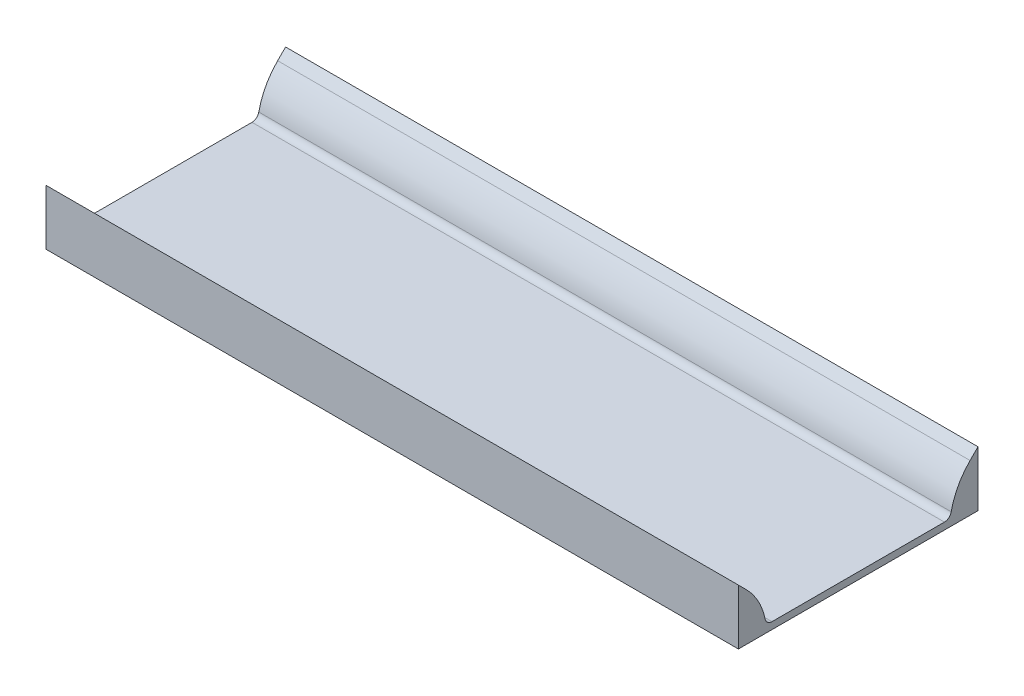
ISO-10303-21;
HEADER;
FILE_DESCRIPTION(('STEP AP214'),'2;1');
FILE_NAME('part.step','',(''),(''),'','','');
FILE_SCHEMA(('AUTOMOTIVE_DESIGN { 1 0 10303 214 1 1 1 1 }'));
ENDSEC;
DATA;
#1=APPLICATION_CONTEXT('core data for automotive mechanical design processes');
#2=APPLICATION_PROTOCOL_DEFINITION('international standard','automotive_design',2000,#1);
#3=PRODUCT_CONTEXT('',#1,'mechanical');
#4=PRODUCT('Part','Part','',(#3));
#5=PRODUCT_RELATED_PRODUCT_CATEGORY('part','',(#4));
#6=PRODUCT_DEFINITION_FORMATION('','',#4);
#7=PRODUCT_DEFINITION_CONTEXT('part definition',#1,'design');
#8=PRODUCT_DEFINITION('design','',#6,#7);
#9=PRODUCT_DEFINITION_SHAPE('','',#8);
#10=(LENGTH_UNIT() NAMED_UNIT(*) SI_UNIT(.MILLI.,.METRE.));
#11=(NAMED_UNIT(*) PLANE_ANGLE_UNIT() SI_UNIT($,.RADIAN.));
#12=(NAMED_UNIT(*) SI_UNIT($,.STERADIAN.) SOLID_ANGLE_UNIT());
#13=UNCERTAINTY_MEASURE_WITH_UNIT(LENGTH_MEASURE(1.E-05),#10,'distance_accuracy_value','');
#14=(GEOMETRIC_REPRESENTATION_CONTEXT(3) GLOBAL_UNCERTAINTY_ASSIGNED_CONTEXT((#13)) GLOBAL_UNIT_ASSIGNED_CONTEXT((#10,
#11,#12)) REPRESENTATION_CONTEXT('',''));
#15=CARTESIAN_POINT('',(0.,0.,0.));
#16=DIRECTION('',(0.,0.,1.));
#17=DIRECTION('',(1.,0.,0.));
#18=AXIS2_PLACEMENT_3D('',#15,#16,#17);
#19=CARTESIAN_POINT('',(63.5,10.16,-21.971));
#20=DIRECTION('',(-1.,0.,0.));
#21=DIRECTION('',(0.,0.,1.));
#22=AXIS2_PLACEMENT_3D('',#19,#20,#21);
#23=PLANE('',#22);
#24=DIRECTION('',(0.,0.,-1.));
#25=VECTOR('',#24,1.);
#26=CARTESIAN_POINT('',(63.5,1.27,0.));
#27=LINE('',#26,#25);
#28=CARTESIAN_POINT('',(63.5,1.27,15.8132118717615));
#29=VERTEX_POINT('',#28);
#30=CARTESIAN_POINT('',(63.5,1.27,-15.8132118717615));
#31=VERTEX_POINT('',#30);
#32=EDGE_CURVE('E179',#29,#31,#27,.T.);
#33=ORIENTED_EDGE('',*,*,#32,.F.);
#34=CARTESIAN_POINT('',(63.5,2.54,15.8132118717615));
#35=DIRECTION('',(-1.,0.,0.));
#36=DIRECTION('',(0.,0.,1.));
#37=AXIS2_PLACEMENT_3D('',#34,#35,#36);
#38=CIRCLE('',#37,1.27);
#39=CARTESIAN_POINT('',(63.5,2.28410749572498,17.0571648557025));
#40=VERTEX_POINT('',#39);
#41=EDGE_CURVE('E175',#29,#40,#38,.T.);
#42=ORIENTED_EDGE('',*,*,#41,.T.);
#43=CARTESIAN_POINT('',(63.5,-0.274817547025219,29.4966946951131));
#44=DIRECTION('',(-1.,0.,0.));
#45=DIRECTION('',(0.,0.,1.));
#46=AXIS2_PLACEMENT_3D('',#43,#44,#45);
#47=CIRCLE('',#46,12.7);
#48=CARTESIAN_POINT('',(63.5,8.70543857404397,20.516438574044));
#49=VERTEX_POINT('',#48);
#50=EDGE_CURVE('E156',#40,#49,#47,.F.);
#51=ORIENTED_EDGE('',*,*,#50,.T.);
#52=DIRECTION('',(0.,0.707106781186546,0.70710678118655));
#53=VECTOR('',#52,1.);
#54=CARTESIAN_POINT('',(63.5,5.08,16.891));
#55=LINE('',#54,#53);
#56=CARTESIAN_POINT('',(63.5,10.16,21.971));
#57=VERTEX_POINT('',#56);
#58=EDGE_CURVE('E126',#49,#57,#55,.T.);
#59=ORIENTED_EDGE('',*,*,#58,.T.);
#60=DIRECTION('',(0.,-1.,0.));
#61=VECTOR('',#60,1.);
#62=CARTESIAN_POINT('',(63.5,10.16,21.971));
#63=LINE('',#62,#61);
#64=CARTESIAN_POINT('',(63.5,0.,21.971));
#65=VERTEX_POINT('',#64);
#66=EDGE_CURVE('E201',#57,#65,#63,.T.);
#67=ORIENTED_EDGE('',*,*,#66,.T.);
#68=DIRECTION('',(0.,0.,-1.));
#69=VECTOR('',#68,1.);
#70=CARTESIAN_POINT('',(63.5,0.,-21.971));
#71=LINE('',#70,#69);
#72=CARTESIAN_POINT('',(63.5,0.,-21.971));
#73=VERTEX_POINT('',#72);
#74=EDGE_CURVE('E142',#65,#73,#71,.T.);
#75=ORIENTED_EDGE('',*,*,#74,.T.);
#76=DIRECTION('',(0.,-1.,0.));
#77=VECTOR('',#76,1.);
#78=CARTESIAN_POINT('',(63.5,10.16,-21.971));
#79=LINE('',#78,#77);
#80=CARTESIAN_POINT('',(63.5,10.16,-21.971));
#81=VERTEX_POINT('',#80);
#82=EDGE_CURVE('E127',#81,#73,#79,.T.);
#83=ORIENTED_EDGE('',*,*,#82,.F.);
#84=DIRECTION('',(0.,0.707106781186551,-0.707106781186544));
#85=VECTOR('',#84,1.);
#86=CARTESIAN_POINT('',(63.5,10.16,-21.971));
#87=LINE('',#86,#85);
#88=CARTESIAN_POINT('',(63.5,8.70543857404386,-20.5164385740439));
#89=VERTEX_POINT('',#88);
#90=EDGE_CURVE('E115',#81,#89,#87,.F.);
#91=ORIENTED_EDGE('',*,*,#90,.T.);
#92=CARTESIAN_POINT('',(63.5,-0.27481754702525,-29.4966946951131));
#93=DIRECTION('',(-1.,0.,0.));
#94=DIRECTION('',(0.,0.,1.));
#95=AXIS2_PLACEMENT_3D('',#92,#93,#94);
#96=CIRCLE('',#95,12.7);
#97=CARTESIAN_POINT('',(63.5,2.28410749572498,-17.0571648557025));
#98=VERTEX_POINT('',#97);
#99=EDGE_CURVE('E154',#89,#98,#96,.F.);
#100=ORIENTED_EDGE('',*,*,#99,.T.);
#101=CARTESIAN_POINT('',(63.5,2.54,-15.8132118717615));
#102=DIRECTION('',(-1.,0.,0.));
#103=DIRECTION('',(0.,0.,1.));
#104=AXIS2_PLACEMENT_3D('',#101,#102,#103);
#105=CIRCLE('',#104,1.27);
#106=EDGE_CURVE('E47',#98,#31,#105,.T.);
#107=ORIENTED_EDGE('',*,*,#106,.T.);
#108=EDGE_LOOP('',(#33,#42,#51,#59,#67,#75,#83,#91,#100,#107));
#109=FACE_BOUND('',#108,.T.);
#110=ADVANCED_FACE('F39',(#109),#23,.F.);
#111=CARTESIAN_POINT('',(-63.5,10.16,-21.971));
#112=DIRECTION('',(0.,0.,1.));
#113=DIRECTION('',(1.,0.,0.));
#114=AXIS2_PLACEMENT_3D('',#111,#112,#113);
#115=PLANE('',#114);
#116=DIRECTION('',(-1.,0.,0.));
#117=VECTOR('',#116,1.);
#118=CARTESIAN_POINT('',(-63.5,0.,-21.971));
#119=LINE('',#118,#117);
#120=CARTESIAN_POINT('',(-63.5,0.,-21.971));
#121=VERTEX_POINT('',#120);
#122=EDGE_CURVE('E195',#73,#121,#119,.T.);
#123=ORIENTED_EDGE('',*,*,#122,.T.);
#124=DIRECTION('',(0.,-1.,0.));
#125=VECTOR('',#124,1.);
#126=CARTESIAN_POINT('',(-63.5,10.16,-21.971));
#127=LINE('',#126,#125);
#128=CARTESIAN_POINT('',(-63.5,10.16,-21.971));
#129=VERTEX_POINT('',#128);
#130=EDGE_CURVE('E135',#129,#121,#127,.T.);
#131=ORIENTED_EDGE('',*,*,#130,.F.);
#132=DIRECTION('',(-1.,0.,0.));
#133=VECTOR('',#132,1.);
#134=CARTESIAN_POINT('',(-63.5,10.16,-21.971));
#135=LINE('',#134,#133);
#136=EDGE_CURVE('E119',#81,#129,#135,.T.);
#137=ORIENTED_EDGE('',*,*,#136,.F.);
#138=ORIENTED_EDGE('',*,*,#82,.T.);
#139=EDGE_LOOP('',(#123,#131,#137,#138));
#140=FACE_BOUND('',#139,.T.);
#141=ADVANCED_FACE('F132',(#140),#115,.F.);
#142=CARTESIAN_POINT('',(-63.5,10.16,-21.971));
#143=DIRECTION('',(1.,0.,0.));
#144=DIRECTION('',(0.,0.,-1.));
#145=AXIS2_PLACEMENT_3D('',#142,#143,#144);
#146=PLANE('',#145);
#147=DIRECTION('',(0.,-0.707106781186546,-0.70710678118655));
#148=VECTOR('',#147,1.);
#149=CARTESIAN_POINT('',(-63.5,5.08,16.891));
#150=LINE('',#149,#148);
#151=CARTESIAN_POINT('',(-63.5,10.16,21.971));
#152=VERTEX_POINT('',#151);
#153=CARTESIAN_POINT('',(-63.5,8.70543857404397,20.516438574044));
#154=VERTEX_POINT('',#153);
#155=EDGE_CURVE('E151',#152,#154,#150,.T.);
#156=ORIENTED_EDGE('',*,*,#155,.T.);
#157=CARTESIAN_POINT('',(-63.5,-0.274817547025219,29.4966946951131));
#158=DIRECTION('',(1.,0.,0.));
#159=DIRECTION('',(0.,0.,-1.));
#160=AXIS2_PLACEMENT_3D('',#157,#158,#159);
#161=CIRCLE('',#160,12.7);
#162=CARTESIAN_POINT('',(-63.5,2.28410749572498,17.0571648557025));
#163=VERTEX_POINT('',#162);
#164=EDGE_CURVE('E162',#154,#163,#161,.F.);
#165=ORIENTED_EDGE('',*,*,#164,.T.);
#166=CARTESIAN_POINT('',(-63.5,2.54,15.8132118717615));
#167=DIRECTION('',(1.,0.,0.));
#168=DIRECTION('',(0.,0.,-1.));
#169=AXIS2_PLACEMENT_3D('',#166,#167,#168);
#170=CIRCLE('',#169,1.27);
#171=CARTESIAN_POINT('',(-63.5,1.27,15.8132118717615));
#172=VERTEX_POINT('',#171);
#173=EDGE_CURVE('E177',#163,#172,#170,.T.);
#174=ORIENTED_EDGE('',*,*,#173,.T.);
#175=DIRECTION('',(0.,0.,1.));
#176=VECTOR('',#175,1.);
#177=CARTESIAN_POINT('',(-63.5,1.27,0.));
#178=LINE('',#177,#176);
#179=CARTESIAN_POINT('',(-63.5,1.27,-15.8132118717615));
#180=VERTEX_POINT('',#179);
#181=EDGE_CURVE('E184',#180,#172,#178,.T.);
#182=ORIENTED_EDGE('',*,*,#181,.F.);
#183=CARTESIAN_POINT('',(-63.5,2.54,-15.8132118717615));
#184=DIRECTION('',(1.,0.,0.));
#185=DIRECTION('',(0.,0.,-1.));
#186=AXIS2_PLACEMENT_3D('',#183,#184,#185);
#187=CIRCLE('',#186,1.27);
#188=CARTESIAN_POINT('',(-63.5,2.28410749572498,-17.0571648557025));
#189=VERTEX_POINT('',#188);
#190=EDGE_CURVE('E11',#180,#189,#187,.T.);
#191=ORIENTED_EDGE('',*,*,#190,.T.);
#192=CARTESIAN_POINT('',(-63.5,-0.27481754702525,-29.4966946951131));
#193=DIRECTION('',(1.,0.,0.));
#194=DIRECTION('',(0.,0.,-1.));
#195=AXIS2_PLACEMENT_3D('',#192,#193,#194);
#196=CIRCLE('',#195,12.7);
#197=CARTESIAN_POINT('',(-63.5,8.70543857404386,-20.5164385740439));
#198=VERTEX_POINT('',#197);
#199=EDGE_CURVE('E160',#189,#198,#196,.F.);
#200=ORIENTED_EDGE('',*,*,#199,.T.);
#201=DIRECTION('',(0.,-0.707106781186551,0.707106781186544));
#202=VECTOR('',#201,1.);
#203=CARTESIAN_POINT('',(-63.5,10.16,-21.971));
#204=LINE('',#203,#202);
#205=EDGE_CURVE('E149',#198,#129,#204,.F.);
#206=ORIENTED_EDGE('',*,*,#205,.T.);
#207=ORIENTED_EDGE('',*,*,#130,.T.);
#208=DIRECTION('',(0.,0.,1.));
#209=VECTOR('',#208,1.);
#210=CARTESIAN_POINT('',(-63.5,0.,-21.971));
#211=LINE('',#210,#209);
#212=CARTESIAN_POINT('',(-63.5,0.,21.971));
#213=VERTEX_POINT('',#212);
#214=EDGE_CURVE('E190',#121,#213,#211,.T.);
#215=ORIENTED_EDGE('',*,*,#214,.T.);
#216=DIRECTION('',(0.,-1.,0.));
#217=VECTOR('',#216,1.);
#218=CARTESIAN_POINT('',(-63.5,10.16,21.971));
#219=LINE('',#218,#217);
#220=EDGE_CURVE('E144',#152,#213,#219,.T.);
#221=ORIENTED_EDGE('',*,*,#220,.F.);
#222=EDGE_LOOP('',(#156,#165,#174,#182,#191,#200,#206,#207,#215,#221));
#223=FACE_BOUND('',#222,.T.);
#224=ADVANCED_FACE('F188',(#223),#146,.F.);
#225=CARTESIAN_POINT('',(-63.5,10.16,21.971));
#226=DIRECTION('',(0.,0.,-1.));
#227=DIRECTION('',(-1.,0.,0.));
#228=AXIS2_PLACEMENT_3D('',#225,#226,#227);
#229=PLANE('',#228);
#230=DIRECTION('',(1.,0.,0.));
#231=VECTOR('',#230,1.);
#232=CARTESIAN_POINT('',(-63.5,0.,21.971));
#233=LINE('',#232,#231);
#234=EDGE_CURVE('E137',#213,#65,#233,.T.);
#235=ORIENTED_EDGE('',*,*,#234,.T.);
#236=ORIENTED_EDGE('',*,*,#66,.F.);
#237=DIRECTION('',(1.,0.,0.));
#238=VECTOR('',#237,1.);
#239=CARTESIAN_POINT('',(-63.5,10.16,21.971));
#240=LINE('',#239,#238);
#241=EDGE_CURVE('E136',#152,#57,#240,.T.);
#242=ORIENTED_EDGE('',*,*,#241,.F.);
#243=ORIENTED_EDGE('',*,*,#220,.T.);
#244=EDGE_LOOP('',(#235,#236,#242,#243));
#245=FACE_BOUND('',#244,.T.);
#246=ADVANCED_FACE('F204',(#245),#229,.F.);
#247=CARTESIAN_POINT('',(0.,0.,0.));
#248=DIRECTION('',(0.,1.,0.));
#249=DIRECTION('',(0.,0.,1.));
#250=AXIS2_PLACEMENT_3D('',#247,#248,#249);
#251=PLANE('',#250);
#252=ORIENTED_EDGE('',*,*,#74,.F.);
#253=ORIENTED_EDGE('',*,*,#234,.F.);
#254=ORIENTED_EDGE('',*,*,#214,.F.);
#255=ORIENTED_EDGE('',*,*,#122,.F.);
#256=EDGE_LOOP('',(#252,#253,#254,#255));
#257=FACE_BOUND('',#256,.T.);
#258=ADVANCED_FACE('F194',(#257),#251,.F.);
#259=CARTESIAN_POINT('',(0.,1.27,0.));
#260=DIRECTION('',(0.,1.,0.));
#261=DIRECTION('',(0.,0.,1.));
#262=AXIS2_PLACEMENT_3D('',#259,#260,#261);
#263=PLANE('',#262);
#264=ORIENTED_EDGE('',*,*,#181,.T.);
#265=DIRECTION('',(1.,0.,0.));
#266=VECTOR('',#265,1.);
#267=CARTESIAN_POINT('',(63.5,1.27,15.8132118717615));
#268=LINE('',#267,#266);
#269=EDGE_CURVE('E168',#172,#29,#268,.T.);
#270=ORIENTED_EDGE('',*,*,#269,.T.);
#271=ORIENTED_EDGE('',*,*,#32,.T.);
#272=DIRECTION('',(1.,0.,0.));
#273=VECTOR('',#272,1.);
#274=CARTESIAN_POINT('',(-63.5,1.27,-15.8132118717615));
#275=LINE('',#274,#273);
#276=EDGE_CURVE('E166',#31,#180,#275,.F.);
#277=ORIENTED_EDGE('',*,*,#276,.T.);
#278=EDGE_LOOP('',(#264,#270,#271,#277));
#279=FACE_BOUND('',#278,.T.);
#280=ADVANCED_FACE('F182',(#279),#263,.T.);
#281=CARTESIAN_POINT('',(0.,5.08,16.891));
#282=DIRECTION('',(0.,0.70710678118655,-0.707106781186546));
#283=DIRECTION('',(-1.,0.,0.));
#284=AXIS2_PLACEMENT_3D('',#281,#282,#283);
#285=PLANE('',#284);
#286=ORIENTED_EDGE('',*,*,#58,.F.);
#287=DIRECTION('',(1.,0.,0.));
#288=VECTOR('',#287,1.);
#289=CARTESIAN_POINT('',(-63.5,8.70543857404397,20.516438574044));
#290=LINE('',#289,#288);
#291=EDGE_CURVE('E158',#49,#154,#290,.F.);
#292=ORIENTED_EDGE('',*,*,#291,.T.);
#293=ORIENTED_EDGE('',*,*,#155,.F.);
#294=ORIENTED_EDGE('',*,*,#241,.T.);
#295=EDGE_LOOP('',(#286,#292,#293,#294));
#296=FACE_BOUND('',#295,.T.);
#297=ADVANCED_FACE('F221',(#296),#285,.T.);
#298=CARTESIAN_POINT('',(0.,10.16,-21.971));
#299=DIRECTION('',(0.,-0.707106781186544,-0.707106781186551));
#300=DIRECTION('',(1.,0.,0.));
#301=AXIS2_PLACEMENT_3D('',#298,#299,#300);
#302=PLANE('',#301);
#303=ORIENTED_EDGE('',*,*,#205,.F.);
#304=DIRECTION('',(-1.,0.,0.));
#305=VECTOR('',#304,1.);
#306=CARTESIAN_POINT('',(63.5,8.70543857404386,-20.5164385740439));
#307=LINE('',#306,#305);
#308=EDGE_CURVE('E121',#198,#89,#307,.F.);
#309=ORIENTED_EDGE('',*,*,#308,.T.);
#310=ORIENTED_EDGE('',*,*,#90,.F.);
#311=ORIENTED_EDGE('',*,*,#136,.T.);
#312=EDGE_LOOP('',(#303,#309,#310,#311));
#313=FACE_BOUND('',#312,.T.);
#314=ADVANCED_FACE('F118',(#313),#302,.F.);
#315=CARTESIAN_POINT('',(0.,-0.274817547025219,29.4966946951131));
#316=DIRECTION('',(-1.,0.,0.));
#317=DIRECTION('',(0.,0.,1.));
#318=AXIS2_PLACEMENT_3D('',#315,#316,#317);
#319=CYLINDRICAL_SURFACE('',#318,12.7);
#320=ORIENTED_EDGE('',*,*,#50,.F.);
#321=DIRECTION('',(-1.,0.,0.));
#322=VECTOR('',#321,1.);
#323=CARTESIAN_POINT('',(0.,2.28410749572498,17.0571648557025));
#324=LINE('',#323,#322);
#325=EDGE_CURVE('E171',#40,#163,#324,.T.);
#326=ORIENTED_EDGE('',*,*,#325,.T.);
#327=ORIENTED_EDGE('',*,*,#164,.F.);
#328=ORIENTED_EDGE('',*,*,#291,.F.);
#329=EDGE_LOOP('',(#320,#326,#327,#328));
#330=FACE_BOUND('',#329,.T.);
#331=ADVANCED_FACE('F214',(#330),#319,.T.);
#332=CARTESIAN_POINT('',(0.,-0.27481754702525,-29.4966946951131));
#333=DIRECTION('',(-1.,0.,0.));
#334=DIRECTION('',(0.,0.,1.));
#335=AXIS2_PLACEMENT_3D('',#332,#333,#334);
#336=CYLINDRICAL_SURFACE('',#335,12.7);
#337=ORIENTED_EDGE('',*,*,#199,.F.);
#338=DIRECTION('',(-1.,0.,0.));
#339=VECTOR('',#338,1.);
#340=CARTESIAN_POINT('',(0.,2.28410749572498,-17.0571648557025));
#341=LINE('',#340,#339);
#342=EDGE_CURVE('E173',#189,#98,#341,.F.);
#343=ORIENTED_EDGE('',*,*,#342,.T.);
#344=ORIENTED_EDGE('',*,*,#99,.F.);
#345=ORIENTED_EDGE('',*,*,#308,.F.);
#346=EDGE_LOOP('',(#337,#343,#344,#345));
#347=FACE_BOUND('',#346,.T.);
#348=ADVANCED_FACE('F187',(#347),#336,.T.);
#349=CARTESIAN_POINT('',(0.,2.54,15.8132118717615));
#350=DIRECTION('',(-1.,0.,0.));
#351=DIRECTION('',(0.,0.,1.));
#352=AXIS2_PLACEMENT_3D('',#349,#350,#351);
#353=CYLINDRICAL_SURFACE('',#352,1.27);
#354=ORIENTED_EDGE('',*,*,#173,.F.);
#355=ORIENTED_EDGE('',*,*,#325,.F.);
#356=ORIENTED_EDGE('',*,*,#41,.F.);
#357=ORIENTED_EDGE('',*,*,#269,.F.);
#358=EDGE_LOOP('',(#354,#355,#356,#357));
#359=FACE_BOUND('',#358,.T.);
#360=ADVANCED_FACE('F217',(#359),#353,.F.);
#361=CARTESIAN_POINT('',(0.,2.54,-15.8132118717615));
#362=DIRECTION('',(-1.,0.,0.));
#363=DIRECTION('',(0.,0.,1.));
#364=AXIS2_PLACEMENT_3D('',#361,#362,#363);
#365=CYLINDRICAL_SURFACE('',#364,1.27);
#366=ORIENTED_EDGE('',*,*,#190,.F.);
#367=ORIENTED_EDGE('',*,*,#276,.F.);
#368=ORIENTED_EDGE('',*,*,#106,.F.);
#369=ORIENTED_EDGE('',*,*,#342,.F.);
#370=EDGE_LOOP('',(#366,#367,#368,#369));
#371=FACE_BOUND('',#370,.T.);
#372=ADVANCED_FACE('F41',(#371),#365,.F.);
#373=CLOSED_SHELL('',(#110,#141,#224,#246,#258,#280,#297,#314,#331,#348,#360,#372));
#374=MANIFOLD_SOLID_BREP('B2',#373);
#375=ADVANCED_BREP_SHAPE_REPRESENTATION('',(#18,#374),#14);
#376=SHAPE_DEFINITION_REPRESENTATION(#9,#375);
ENDSEC;
END-ISO-10303-21;
